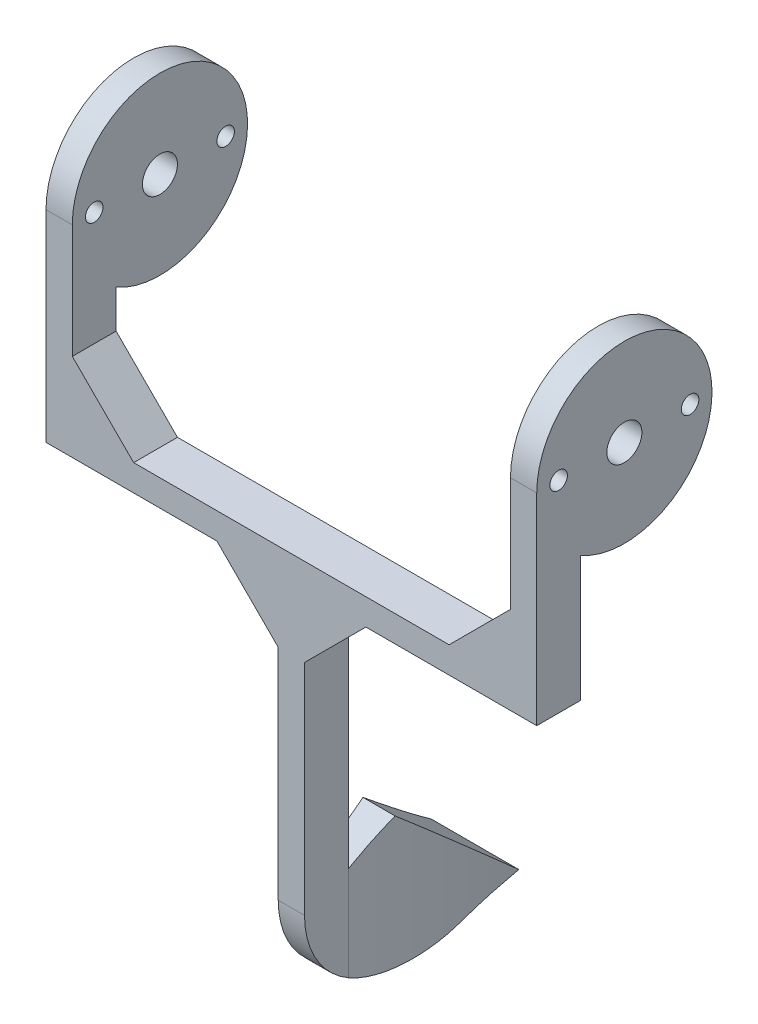
ISO-10303-21;
HEADER;
FILE_DESCRIPTION(('STEP AP214'),'2;1');
FILE_NAME('part.step','',(''),(''),'','','');
FILE_SCHEMA(('AUTOMOTIVE_DESIGN { 1 0 10303 214 1 1 1 1 }'));
ENDSEC;
DATA;
#1=APPLICATION_CONTEXT('core data for automotive mechanical design processes');
#2=APPLICATION_PROTOCOL_DEFINITION('international standard','automotive_design',2000,#1);
#3=PRODUCT_CONTEXT('',#1,'mechanical');
#4=PRODUCT('Part','Part','',(#3));
#5=PRODUCT_RELATED_PRODUCT_CATEGORY('part','',(#4));
#6=PRODUCT_DEFINITION_FORMATION('','',#4);
#7=PRODUCT_DEFINITION_CONTEXT('part definition',#1,'design');
#8=PRODUCT_DEFINITION('design','',#6,#7);
#9=PRODUCT_DEFINITION_SHAPE('','',#8);
#10=(LENGTH_UNIT() NAMED_UNIT(*) SI_UNIT(.MILLI.,.METRE.));
#11=(NAMED_UNIT(*) PLANE_ANGLE_UNIT() SI_UNIT($,.RADIAN.));
#12=(NAMED_UNIT(*) SI_UNIT($,.STERADIAN.) SOLID_ANGLE_UNIT());
#13=UNCERTAINTY_MEASURE_WITH_UNIT(LENGTH_MEASURE(1.E-05),#10,'distance_accuracy_value','');
#14=(GEOMETRIC_REPRESENTATION_CONTEXT(3) GLOBAL_UNCERTAINTY_ASSIGNED_CONTEXT((#13)) GLOBAL_UNIT_ASSIGNED_CONTEXT((#10,
#11,#12)) REPRESENTATION_CONTEXT('',''));
#15=CARTESIAN_POINT('',(0.,0.,0.));
#16=DIRECTION('',(0.,0.,1.));
#17=DIRECTION('',(1.,0.,0.));
#18=AXIS2_PLACEMENT_3D('',#15,#16,#17);
#19=CARTESIAN_POINT('',(1.5,-35.,0.));
#20=DIRECTION('',(1.,0.,0.));
#21=DIRECTION('',(0.,0.,-1.));
#22=AXIS2_PLACEMENT_3D('',#19,#20,#21);
#23=PLANE('',#22);
#24=DIRECTION('',(0.,0.,1.));
#25=VECTOR('',#24,1.);
#26=CARTESIAN_POINT('',(1.5,-10.,-4.89949493661168));
#27=LINE('',#26,#25);
#28=CARTESIAN_POINT('',(1.5,-10.,5.));
#29=VERTEX_POINT('',#28);
#30=CARTESIAN_POINT('',(1.5,-10.,10.));
#31=VERTEX_POINT('',#30);
#32=EDGE_CURVE('E379',#29,#31,#27,.T.);
#33=ORIENTED_EDGE('',*,*,#32,.T.);
#34=DIRECTION('',(0.,-1.,0.));
#35=VECTOR('',#34,1.);
#36=CARTESIAN_POINT('',(1.5,-3.,10.));
#37=LINE('',#36,#35);
#38=CARTESIAN_POINT('',(1.5,-35.,10.));
#39=VERTEX_POINT('',#38);
#40=EDGE_CURVE('E458',#31,#39,#37,.T.);
#41=ORIENTED_EDGE('',*,*,#40,.T.);
#42=CARTESIAN_POINT('',(1.49999999999999,-35.,0.));
#43=DIRECTION('',(-1.,0.,0.));
#44=DIRECTION('',(0.,0.,1.));
#45=AXIS2_PLACEMENT_3D('',#42,#43,#44);
#46=CIRCLE('',#45,10.);
#47=CARTESIAN_POINT('',(1.5,-43.6602540378444,5.));
#48=VERTEX_POINT('',#47);
#49=EDGE_CURVE('E439',#48,#39,#46,.T.);
#50=ORIENTED_EDGE('',*,*,#49,.F.);
#51=DIRECTION('',(0.,1.,0.));
#52=VECTOR('',#51,1.);
#53=CARTESIAN_POINT('',(1.5,-45.,5.));
#54=LINE('',#53,#52);
#55=CARTESIAN_POINT('',(1.5,-32.8867513459482,5.));
#56=VERTEX_POINT('',#55);
#57=EDGE_CURVE('E240',#48,#56,#54,.T.);
#58=ORIENTED_EDGE('',*,*,#57,.T.);
#59=DIRECTION('',(0.,1.,0.));
#60=VECTOR('',#59,1.);
#61=CARTESIAN_POINT('',(1.5,-3.,5.));
#62=LINE('',#61,#60);
#63=EDGE_CURVE('E315',#56,#29,#62,.T.);
#64=ORIENTED_EDGE('',*,*,#63,.T.);
#65=EDGE_LOOP('',(#33,#41,#50,#58,#64));
#66=FACE_BOUND('',#65,.T.);
#67=ADVANCED_FACE('F36',(#66),#23,.T.);
#68=CARTESIAN_POINT('',(-1.5,-35.,0.));
#69=DIRECTION('',(1.,0.,0.));
#70=DIRECTION('',(0.,0.,-1.));
#71=AXIS2_PLACEMENT_3D('',#68,#69,#70);
#72=PLANE('',#71);
#73=DIRECTION('',(0.,-1.,0.));
#74=VECTOR('',#73,1.);
#75=CARTESIAN_POINT('',(-1.5,-3.,10.));
#76=LINE('',#75,#74);
#77=CARTESIAN_POINT('',(-1.5,-10.,10.));
#78=VERTEX_POINT('',#77);
#79=CARTESIAN_POINT('',(-1.50000000000001,-35.,10.));
#80=VERTEX_POINT('',#79);
#81=EDGE_CURVE('E429',#78,#80,#76,.T.);
#82=ORIENTED_EDGE('',*,*,#81,.F.);
#83=DIRECTION('',(0.,0.,1.));
#84=VECTOR('',#83,1.);
#85=CARTESIAN_POINT('',(-1.5,-10.,-4.89949493661168));
#86=LINE('',#85,#84);
#87=CARTESIAN_POINT('',(-1.5,-10.,5.));
#88=VERTEX_POINT('',#87);
#89=EDGE_CURVE('E392',#88,#78,#86,.T.);
#90=ORIENTED_EDGE('',*,*,#89,.F.);
#91=DIRECTION('',(0.,1.,0.));
#92=VECTOR('',#91,1.);
#93=CARTESIAN_POINT('',(-1.5,-3.,5.));
#94=LINE('',#93,#92);
#95=CARTESIAN_POINT('',(-1.50000000000001,-32.8867513459482,5.));
#96=VERTEX_POINT('',#95);
#97=EDGE_CURVE('E431',#96,#88,#94,.T.);
#98=ORIENTED_EDGE('',*,*,#97,.F.);
#99=DIRECTION('',(0.,1.,0.));
#100=VECTOR('',#99,1.);
#101=CARTESIAN_POINT('',(-1.50000000000001,-45.,5.));
#102=LINE('',#101,#100);
#103=CARTESIAN_POINT('',(-1.50000000000001,-43.6602540378444,5.));
#104=VERTEX_POINT('',#103);
#105=EDGE_CURVE('E242',#104,#96,#102,.T.);
#106=ORIENTED_EDGE('',*,*,#105,.F.);
#107=CARTESIAN_POINT('',(-1.5,-35.,0.));
#108=DIRECTION('',(1.,0.,0.));
#109=DIRECTION('',(0.,0.,-1.));
#110=AXIS2_PLACEMENT_3D('',#107,#108,#109);
#111=CIRCLE('',#110,10.);
#112=EDGE_CURVE('E436',#80,#104,#111,.T.);
#113=ORIENTED_EDGE('',*,*,#112,.F.);
#114=EDGE_LOOP('',(#82,#90,#98,#106,#113));
#115=FACE_BOUND('',#114,.T.);
#116=ADVANCED_FACE('F288',(#115),#72,.F.);
#117=CARTESIAN_POINT('',(0.,-3.,10.));
#118=DIRECTION('',(0.,1.,0.));
#119=DIRECTION('',(-1.,0.,0.));
#120=AXIS2_PLACEMENT_3D('',#117,#118,#119);
#121=PLANE('',#120);
#122=DIRECTION('',(1.,0.,0.));
#123=VECTOR('',#122,1.);
#124=CARTESIAN_POINT('',(0.,-3.,10.));
#125=LINE('',#124,#123);
#126=CARTESIAN_POINT('',(8.5,-3.,10.));
#127=VERTEX_POINT('',#126);
#128=CARTESIAN_POINT('',(28.,-3.,10.));
#129=VERTEX_POINT('',#128);
#130=EDGE_CURVE('E61',#127,#129,#125,.T.);
#131=ORIENTED_EDGE('',*,*,#130,.F.);
#132=DIRECTION('',(0.,0.,1.));
#133=VECTOR('',#132,1.);
#134=CARTESIAN_POINT('',(8.5,-3.,-4.89949493661168));
#135=LINE('',#134,#133);
#136=CARTESIAN_POINT('',(8.49999999999999,-3.,5.));
#137=VERTEX_POINT('',#136);
#138=EDGE_CURVE('E383',#137,#127,#135,.T.);
#139=ORIENTED_EDGE('',*,*,#138,.F.);
#140=DIRECTION('',(1.,0.,0.));
#141=VECTOR('',#140,1.);
#142=CARTESIAN_POINT('',(-28.,-3.,5.));
#143=LINE('',#142,#141);
#144=CARTESIAN_POINT('',(28.,-3.,5.));
#145=VERTEX_POINT('',#144);
#146=EDGE_CURVE('E322',#137,#145,#143,.T.);
#147=ORIENTED_EDGE('',*,*,#146,.T.);
#148=DIRECTION('',(0.,0.,-1.));
#149=VECTOR('',#148,1.);
#150=CARTESIAN_POINT('',(28.,-3.,10.));
#151=LINE('',#150,#149);
#152=EDGE_CURVE('E198',#129,#145,#151,.T.);
#153=ORIENTED_EDGE('',*,*,#152,.F.);
#154=EDGE_LOOP('',(#131,#139,#147,#153));
#155=FACE_BOUND('',#154,.T.);
#156=ADVANCED_FACE('F291',(#155),#121,.F.);
#157=CARTESIAN_POINT('',(-25.,0.,10.));
#158=DIRECTION('',(-1.,0.,0.));
#159=DIRECTION('',(0.,0.,1.));
#160=AXIS2_PLACEMENT_3D('',#157,#158,#159);
#161=PLANE('',#160);
#162=CARTESIAN_POINT('',(-25.,20.,7.5));
#163=DIRECTION('',(-1.,0.,0.));
#164=DIRECTION('',(0.,0.,1.));
#165=AXIS2_PLACEMENT_3D('',#162,#163,#164);
#166=CIRCLE('',#165,1.);
#167=CARTESIAN_POINT('',(-25.,20.,8.5));
#168=VERTEX_POINT('',#167);
#169=EDGE_CURVE('E237',#168,#168,#166,.T.);
#170=ORIENTED_EDGE('',*,*,#169,.T.);
#171=EDGE_LOOP('',(#170));
#172=FACE_BOUND('',#171,.T.);
#173=CARTESIAN_POINT('',(-25.,20.,-7.5));
#174=DIRECTION('',(-1.,0.,0.));
#175=DIRECTION('',(0.,0.,1.));
#176=AXIS2_PLACEMENT_3D('',#173,#174,#175);
#177=CIRCLE('',#176,1.);
#178=CARTESIAN_POINT('',(-25.,20.,-6.5));
#179=VERTEX_POINT('',#178);
#180=EDGE_CURVE('E214',#179,#179,#177,.T.);
#181=ORIENTED_EDGE('',*,*,#180,.T.);
#182=EDGE_LOOP('',(#181));
#183=FACE_BOUND('',#182,.T.);
#184=CARTESIAN_POINT('',(-25.,20.,0.));
#185=DIRECTION('',(-1.,0.,0.));
#186=DIRECTION('',(0.,0.,1.));
#187=AXIS2_PLACEMENT_3D('',#184,#185,#186);
#188=CIRCLE('',#187,2.);
#189=CARTESIAN_POINT('',(-25.,20.,2.));
#190=VERTEX_POINT('',#189);
#191=EDGE_CURVE('E210',#190,#190,#188,.T.);
#192=ORIENTED_EDGE('',*,*,#191,.T.);
#193=EDGE_LOOP('',(#192));
#194=FACE_BOUND('',#193,.T.);
#195=DIRECTION('',(0.,1.,0.));
#196=VECTOR('',#195,1.);
#197=CARTESIAN_POINT('',(-25.,0.,10.));
#198=LINE('',#197,#196);
#199=CARTESIAN_POINT('',(-25.,6.99999999999986,10.));
#200=VERTEX_POINT('',#199);
#201=CARTESIAN_POINT('',(-25.,20.,10.));
#202=VERTEX_POINT('',#201);
#203=EDGE_CURVE('E352',#200,#202,#198,.T.);
#204=ORIENTED_EDGE('',*,*,#203,.F.);
#205=DIRECTION('',(0.,0.,1.));
#206=VECTOR('',#205,1.);
#207=CARTESIAN_POINT('',(-25.,6.99999999999986,-4.89949493661168));
#208=LINE('',#207,#206);
#209=CARTESIAN_POINT('',(-25.,6.99999999999986,5.));
#210=VERTEX_POINT('',#209);
#211=EDGE_CURVE('E400',#210,#200,#208,.T.);
#212=ORIENTED_EDGE('',*,*,#211,.F.);
#213=DIRECTION('',(0.,-1.,0.));
#214=VECTOR('',#213,1.);
#215=CARTESIAN_POINT('',(-25.,0.,5.));
#216=LINE('',#215,#214);
#217=CARTESIAN_POINT('',(-25.,11.3397459621556,5.));
#218=VERTEX_POINT('',#217);
#219=EDGE_CURVE('E332',#218,#210,#216,.T.);
#220=ORIENTED_EDGE('',*,*,#219,.F.);
#221=CARTESIAN_POINT('',(-25.,20.,0.));
#222=DIRECTION('',(-1.,0.,0.));
#223=DIRECTION('',(0.,0.,1.));
#224=AXIS2_PLACEMENT_3D('',#221,#222,#223);
#225=CIRCLE('',#224,10.);
#226=EDGE_CURVE('E211',#202,#218,#225,.T.);
#227=ORIENTED_EDGE('',*,*,#226,.F.);
#228=EDGE_LOOP('',(#204,#212,#220,#227));
#229=FACE_BOUND('',#228,.T.);
#230=ADVANCED_FACE('F38',(#172,#183,#194,#229),#161,.F.);
#231=CARTESIAN_POINT('',(-28.,-3.,10.));
#232=DIRECTION('',(1.,0.,0.));
#233=DIRECTION('',(0.,0.,-1.));
#234=AXIS2_PLACEMENT_3D('',#231,#232,#233);
#235=PLANE('',#234);
#236=CARTESIAN_POINT('',(-28.,20.,7.5));
#237=DIRECTION('',(1.,0.,0.));
#238=DIRECTION('',(0.,0.,-1.));
#239=AXIS2_PLACEMENT_3D('',#236,#237,#238);
#240=CIRCLE('',#239,1.);
#241=CARTESIAN_POINT('',(-28.,20.,6.5));
#242=VERTEX_POINT('',#241);
#243=EDGE_CURVE('E215',#242,#242,#240,.T.);
#244=ORIENTED_EDGE('',*,*,#243,.T.);
#245=EDGE_LOOP('',(#244));
#246=FACE_BOUND('',#245,.T.);
#247=CARTESIAN_POINT('',(-28.,20.,-7.5));
#248=DIRECTION('',(1.,0.,0.));
#249=DIRECTION('',(0.,0.,-1.));
#250=AXIS2_PLACEMENT_3D('',#247,#248,#249);
#251=CIRCLE('',#250,1.);
#252=CARTESIAN_POINT('',(-28.,20.,-8.5));
#253=VERTEX_POINT('',#252);
#254=EDGE_CURVE('E226',#253,#253,#251,.T.);
#255=ORIENTED_EDGE('',*,*,#254,.T.);
#256=EDGE_LOOP('',(#255));
#257=FACE_BOUND('',#256,.T.);
#258=CARTESIAN_POINT('',(-28.,20.,0.));
#259=DIRECTION('',(-1.,0.,0.));
#260=DIRECTION('',(0.,0.,1.));
#261=AXIS2_PLACEMENT_3D('',#258,#259,#260);
#262=CIRCLE('',#261,2.);
#263=CARTESIAN_POINT('',(-28.,20.,2.));
#264=VERTEX_POINT('',#263);
#265=EDGE_CURVE('E341',#264,#264,#262,.T.);
#266=ORIENTED_EDGE('',*,*,#265,.F.);
#267=EDGE_LOOP('',(#266));
#268=FACE_BOUND('',#267,.T.);
#269=CARTESIAN_POINT('',(-28.,20.,0.));
#270=DIRECTION('',(-1.,0.,0.));
#271=DIRECTION('',(0.,0.,-1.));
#272=AXIS2_PLACEMENT_3D('',#269,#270,#271);
#273=CIRCLE('',#272,10.);
#274=CARTESIAN_POINT('',(-28.,20.,10.));
#275=VERTEX_POINT('',#274);
#276=CARTESIAN_POINT('',(-28.,11.3397459621556,5.));
#277=VERTEX_POINT('',#276);
#278=EDGE_CURVE('E335',#275,#277,#273,.T.);
#279=ORIENTED_EDGE('',*,*,#278,.T.);
#280=DIRECTION('',(0.,1.,0.));
#281=VECTOR('',#280,1.);
#282=CARTESIAN_POINT('',(-28.,11.3397459621556,5.));
#283=LINE('',#282,#281);
#284=CARTESIAN_POINT('',(-28.,-3.,5.));
#285=VERTEX_POINT('',#284);
#286=EDGE_CURVE('E319',#285,#277,#283,.T.);
#287=ORIENTED_EDGE('',*,*,#286,.F.);
#288=DIRECTION('',(0.,0.,-1.));
#289=VECTOR('',#288,1.);
#290=CARTESIAN_POINT('',(-28.,-3.,10.));
#291=LINE('',#290,#289);
#292=CARTESIAN_POINT('',(-28.,-3.,10.));
#293=VERTEX_POINT('',#292);
#294=EDGE_CURVE('E45',#293,#285,#291,.T.);
#295=ORIENTED_EDGE('',*,*,#294,.F.);
#296=DIRECTION('',(0.,-1.,0.));
#297=VECTOR('',#296,1.);
#298=CARTESIAN_POINT('',(-28.,-3.,10.));
#299=LINE('',#298,#297);
#300=EDGE_CURVE('E354',#275,#293,#299,.T.);
#301=ORIENTED_EDGE('',*,*,#300,.F.);
#302=EDGE_LOOP('',(#279,#287,#295,#301));
#303=FACE_BOUND('',#302,.T.);
#304=ADVANCED_FACE('F420',(#246,#257,#268,#303),#235,.F.);
#305=CARTESIAN_POINT('',(28.,-3.,10.));
#306=DIRECTION('',(-1.,0.,0.));
#307=DIRECTION('',(0.,0.,1.));
#308=AXIS2_PLACEMENT_3D('',#305,#306,#307);
#309=PLANE('',#308);
#310=CARTESIAN_POINT('',(28.,20.,7.5));
#311=DIRECTION('',(1.,0.,0.));
#312=DIRECTION('',(0.,0.,-1.));
#313=AXIS2_PLACEMENT_3D('',#310,#311,#312);
#314=CIRCLE('',#313,1.);
#315=CARTESIAN_POINT('',(28.,20.,6.5));
#316=VERTEX_POINT('',#315);
#317=EDGE_CURVE('E221',#316,#316,#314,.T.);
#318=ORIENTED_EDGE('',*,*,#317,.F.);
#319=EDGE_LOOP('',(#318));
#320=FACE_BOUND('',#319,.T.);
#321=CARTESIAN_POINT('',(28.,20.,-7.5));
#322=DIRECTION('',(1.,0.,0.));
#323=DIRECTION('',(0.,0.,-1.));
#324=AXIS2_PLACEMENT_3D('',#321,#322,#323);
#325=CIRCLE('',#324,1.);
#326=CARTESIAN_POINT('',(28.,20.,-8.5));
#327=VERTEX_POINT('',#326);
#328=EDGE_CURVE('E234',#327,#327,#325,.T.);
#329=ORIENTED_EDGE('',*,*,#328,.F.);
#330=EDGE_LOOP('',(#329));
#331=FACE_BOUND('',#330,.T.);
#332=CARTESIAN_POINT('',(28.,20.,0.));
#333=DIRECTION('',(-1.,0.,0.));
#334=DIRECTION('',(0.,0.,1.));
#335=AXIS2_PLACEMENT_3D('',#332,#333,#334);
#336=CIRCLE('',#335,2.);
#337=CARTESIAN_POINT('',(28.,20.,2.));
#338=VERTEX_POINT('',#337);
#339=EDGE_CURVE('E342',#338,#338,#336,.T.);
#340=ORIENTED_EDGE('',*,*,#339,.T.);
#341=EDGE_LOOP('',(#340));
#342=FACE_BOUND('',#341,.T.);
#343=DIRECTION('',(0.,1.,0.));
#344=VECTOR('',#343,1.);
#345=CARTESIAN_POINT('',(28.,11.3397459621556,5.));
#346=LINE('',#345,#344);
#347=CARTESIAN_POINT('',(28.,11.3397459621556,5.));
#348=VERTEX_POINT('',#347);
#349=EDGE_CURVE('E313',#145,#348,#346,.T.);
#350=ORIENTED_EDGE('',*,*,#349,.T.);
#351=CARTESIAN_POINT('',(28.,20.,0.));
#352=DIRECTION('',(-1.,0.,0.));
#353=DIRECTION('',(0.,0.,-1.));
#354=AXIS2_PLACEMENT_3D('',#351,#352,#353);
#355=CIRCLE('',#354,10.);
#356=CARTESIAN_POINT('',(28.,20.,10.));
#357=VERTEX_POINT('',#356);
#358=EDGE_CURVE('E336',#357,#348,#355,.T.);
#359=ORIENTED_EDGE('',*,*,#358,.F.);
#360=DIRECTION('',(0.,1.,0.));
#361=VECTOR('',#360,1.);
#362=CARTESIAN_POINT('',(28.,-3.,10.));
#363=LINE('',#362,#361);
#364=EDGE_CURVE('E196',#129,#357,#363,.T.);
#365=ORIENTED_EDGE('',*,*,#364,.F.);
#366=ORIENTED_EDGE('',*,*,#152,.T.);
#367=EDGE_LOOP('',(#350,#359,#365,#366));
#368=FACE_BOUND('',#367,.T.);
#369=ADVANCED_FACE('F367',(#320,#331,#342,#368),#309,.F.);
#370=CARTESIAN_POINT('',(25.,0.,10.));
#371=DIRECTION('',(1.,0.,0.));
#372=DIRECTION('',(0.,0.,-1.));
#373=AXIS2_PLACEMENT_3D('',#370,#371,#372);
#374=PLANE('',#373);
#375=CARTESIAN_POINT('',(25.,20.,7.5));
#376=DIRECTION('',(1.,0.,0.));
#377=DIRECTION('',(0.,0.,-1.));
#378=AXIS2_PLACEMENT_3D('',#375,#376,#377);
#379=CIRCLE('',#378,1.);
#380=CARTESIAN_POINT('',(25.,20.,6.5));
#381=VERTEX_POINT('',#380);
#382=EDGE_CURVE('E40',#381,#381,#379,.T.);
#383=ORIENTED_EDGE('',*,*,#382,.T.);
#384=EDGE_LOOP('',(#383));
#385=FACE_BOUND('',#384,.T.);
#386=CARTESIAN_POINT('',(25.,20.,-7.5));
#387=DIRECTION('',(1.,0.,0.));
#388=DIRECTION('',(0.,0.,-1.));
#389=AXIS2_PLACEMENT_3D('',#386,#387,#388);
#390=CIRCLE('',#389,1.);
#391=CARTESIAN_POINT('',(25.,20.,-8.5));
#392=VERTEX_POINT('',#391);
#393=EDGE_CURVE('E212',#392,#392,#390,.T.);
#394=ORIENTED_EDGE('',*,*,#393,.T.);
#395=EDGE_LOOP('',(#394));
#396=FACE_BOUND('',#395,.T.);
#397=CARTESIAN_POINT('',(25.,20.,0.));
#398=DIRECTION('',(1.,0.,0.));
#399=DIRECTION('',(0.,0.,-1.));
#400=AXIS2_PLACEMENT_3D('',#397,#398,#399);
#401=CIRCLE('',#400,2.);
#402=CARTESIAN_POINT('',(25.,20.,-2.));
#403=VERTEX_POINT('',#402);
#404=EDGE_CURVE('E208',#403,#403,#401,.T.);
#405=ORIENTED_EDGE('',*,*,#404,.T.);
#406=EDGE_LOOP('',(#405));
#407=FACE_BOUND('',#406,.T.);
#408=DIRECTION('',(0.,1.,0.));
#409=VECTOR('',#408,1.);
#410=CARTESIAN_POINT('',(25.,0.,5.));
#411=LINE('',#410,#409);
#412=CARTESIAN_POINT('',(25.,6.99999999999987,5.));
#413=VERTEX_POINT('',#412);
#414=CARTESIAN_POINT('',(25.,11.3397459621556,5.));
#415=VERTEX_POINT('',#414);
#416=EDGE_CURVE('E187',#413,#415,#411,.T.);
#417=ORIENTED_EDGE('',*,*,#416,.F.);
#418=DIRECTION('',(0.,0.,1.));
#419=VECTOR('',#418,1.);
#420=CARTESIAN_POINT('',(25.,6.99999999999987,-4.89949493661168));
#421=LINE('',#420,#419);
#422=CARTESIAN_POINT('',(25.,6.99999999999987,10.));
#423=VERTEX_POINT('',#422);
#424=EDGE_CURVE('E53',#413,#423,#421,.T.);
#425=ORIENTED_EDGE('',*,*,#424,.T.);
#426=DIRECTION('',(0.,-1.,0.));
#427=VECTOR('',#426,1.);
#428=CARTESIAN_POINT('',(25.,0.,10.));
#429=LINE('',#428,#427);
#430=CARTESIAN_POINT('',(25.,20.,10.));
#431=VERTEX_POINT('',#430);
#432=EDGE_CURVE('E186',#431,#423,#429,.T.);
#433=ORIENTED_EDGE('',*,*,#432,.F.);
#434=CARTESIAN_POINT('',(25.,20.,0.));
#435=DIRECTION('',(1.,0.,0.));
#436=DIRECTION('',(0.,0.,-1.));
#437=AXIS2_PLACEMENT_3D('',#434,#435,#436);
#438=CIRCLE('',#437,10.);
#439=EDGE_CURVE('E345',#415,#431,#438,.T.);
#440=ORIENTED_EDGE('',*,*,#439,.F.);
#441=EDGE_LOOP('',(#417,#425,#433,#440));
#442=FACE_BOUND('',#441,.T.);
#443=ADVANCED_FACE('F184',(#385,#396,#407,#442),#374,.F.);
#444=CARTESIAN_POINT('',(-8.49999999999999,-3.00000000000001,5.));
#445=VERTEX_POINT('',#444);
#446=EDGE_CURVE('E329',#285,#445,#143,.T.);
#447=ORIENTED_EDGE('',*,*,#446,.T.);
#448=DIRECTION('',(0.,0.,1.));
#449=VECTOR('',#448,1.);
#450=CARTESIAN_POINT('',(-8.5,-3.,-4.89949493661168));
#451=LINE('',#450,#449);
#452=CARTESIAN_POINT('',(-8.5,-3.,10.));
#453=VERTEX_POINT('',#452);
#454=EDGE_CURVE('E388',#445,#453,#451,.T.);
#455=ORIENTED_EDGE('',*,*,#454,.T.);
#456=EDGE_CURVE('E200',#293,#453,#125,.T.);
#457=ORIENTED_EDGE('',*,*,#456,.F.);
#458=ORIENTED_EDGE('',*,*,#294,.T.);
#459=EDGE_LOOP('',(#447,#455,#457,#458));
#460=FACE_BOUND('',#459,.T.);
#461=ADVANCED_FACE('F423',(#460),#121,.F.);
#462=CARTESIAN_POINT('',(0.,0.,10.));
#463=DIRECTION('',(0.,-1.,0.));
#464=DIRECTION('',(1.,0.,0.));
#465=AXIS2_PLACEMENT_3D('',#462,#463,#464);
#466=PLANE('',#465);
#467=DIRECTION('',(-1.,0.,0.));
#468=VECTOR('',#467,1.);
#469=CARTESIAN_POINT('',(0.,0.,10.));
#470=LINE('',#469,#468);
#471=CARTESIAN_POINT('',(18.,0.,10.));
#472=VERTEX_POINT('',#471);
#473=CARTESIAN_POINT('',(-18.,0.,10.));
#474=VERTEX_POINT('',#473);
#475=EDGE_CURVE('E195',#472,#474,#470,.T.);
#476=ORIENTED_EDGE('',*,*,#475,.F.);
#477=DIRECTION('',(0.,0.,1.));
#478=VECTOR('',#477,1.);
#479=CARTESIAN_POINT('',(18.,0.,-4.89949493661168));
#480=LINE('',#479,#478);
#481=CARTESIAN_POINT('',(18.,0.,5.));
#482=VERTEX_POINT('',#481);
#483=EDGE_CURVE('E176',#482,#472,#480,.T.);
#484=ORIENTED_EDGE('',*,*,#483,.F.);
#485=DIRECTION('',(1.,0.,0.));
#486=VECTOR('',#485,1.);
#487=CARTESIAN_POINT('',(0.,0.,5.));
#488=LINE('',#487,#486);
#489=CARTESIAN_POINT('',(-18.,0.,5.));
#490=VERTEX_POINT('',#489);
#491=EDGE_CURVE('E12',#490,#482,#488,.T.);
#492=ORIENTED_EDGE('',*,*,#491,.F.);
#493=DIRECTION('',(0.,0.,1.));
#494=VECTOR('',#493,1.);
#495=CARTESIAN_POINT('',(-18.,0.,-4.89949493661168));
#496=LINE('',#495,#494);
#497=EDGE_CURVE('E229',#490,#474,#496,.T.);
#498=ORIENTED_EDGE('',*,*,#497,.T.);
#499=EDGE_LOOP('',(#476,#484,#492,#498));
#500=FACE_BOUND('',#499,.T.);
#501=ADVANCED_FACE('F406',(#500),#466,.F.);
#502=CARTESIAN_POINT('',(0.,0.,10.));
#503=DIRECTION('',(0.,0.,1.));
#504=DIRECTION('',(1.,0.,0.));
#505=AXIS2_PLACEMENT_3D('',#502,#503,#504);
#506=PLANE('',#505);
#507=DIRECTION('',(-0.707106781186554,-0.707106781186541,0.));
#508=VECTOR('',#507,1.);
#509=CARTESIAN_POINT('',(25.,6.99999999999987,10.));
#510=LINE('',#509,#508);
#511=EDGE_CURVE('E173',#423,#472,#510,.T.);
#512=ORIENTED_EDGE('',*,*,#511,.T.);
#513=ORIENTED_EDGE('',*,*,#475,.T.);
#514=DIRECTION('',(-0.707106781186554,0.707106781186541,0.));
#515=VECTOR('',#514,1.);
#516=CARTESIAN_POINT('',(-25.,6.99999999999986,10.));
#517=LINE('',#516,#515);
#518=EDGE_CURVE('E396',#474,#200,#517,.T.);
#519=ORIENTED_EDGE('',*,*,#518,.T.);
#520=ORIENTED_EDGE('',*,*,#203,.T.);
#521=DIRECTION('',(-1.,0.,0.));
#522=VECTOR('',#521,1.);
#523=CARTESIAN_POINT('',(28.,20.,10.));
#524=LINE('',#523,#522);
#525=EDGE_CURVE('E338',#202,#275,#524,.T.);
#526=ORIENTED_EDGE('',*,*,#525,.T.);
#527=ORIENTED_EDGE('',*,*,#300,.T.);
#528=ORIENTED_EDGE('',*,*,#456,.T.);
#529=DIRECTION('',(0.707106781186546,-0.707106781186549,0.));
#530=VECTOR('',#529,1.);
#531=CARTESIAN_POINT('',(-8.5,-3.,10.));
#532=LINE('',#531,#530);
#533=EDGE_CURVE('E386',#453,#78,#532,.T.);
#534=ORIENTED_EDGE('',*,*,#533,.T.);
#535=ORIENTED_EDGE('',*,*,#81,.T.);
#536=DIRECTION('',(-1.,0.,0.));
#537=VECTOR('',#536,1.);
#538=CARTESIAN_POINT('',(1.5,-35.,10.));
#539=LINE('',#538,#537);
#540=EDGE_CURVE('E309',#39,#80,#539,.T.);
#541=ORIENTED_EDGE('',*,*,#540,.F.);
#542=ORIENTED_EDGE('',*,*,#40,.F.);
#543=DIRECTION('',(0.707106781186546,0.707106781186549,0.));
#544=VECTOR('',#543,1.);
#545=CARTESIAN_POINT('',(8.5,-3.,10.));
#546=LINE('',#545,#544);
#547=EDGE_CURVE('E363',#31,#127,#546,.T.);
#548=ORIENTED_EDGE('',*,*,#547,.T.);
#549=ORIENTED_EDGE('',*,*,#130,.T.);
#550=ORIENTED_EDGE('',*,*,#364,.T.);
#551=EDGE_CURVE('E194',#357,#431,#524,.T.);
#552=ORIENTED_EDGE('',*,*,#551,.T.);
#553=ORIENTED_EDGE('',*,*,#432,.T.);
#554=EDGE_LOOP('',(#512,#513,#519,#520,#526,#527,#528,#534,#535,#541,#542,#548,#549,#550,#552,#553));
#555=FACE_BOUND('',#554,.T.);
#556=ADVANCED_FACE('F191',(#555),#506,.T.);
#557=CARTESIAN_POINT('',(28.,20.,0.));
#558=DIRECTION('',(-1.,0.,0.));
#559=DIRECTION('',(0.,0.,1.));
#560=AXIS2_PLACEMENT_3D('',#557,#558,#559);
#561=CYLINDRICAL_SURFACE('',#560,10.);
#562=ORIENTED_EDGE('',*,*,#226,.T.);
#563=DIRECTION('',(1.,0.,0.));
#564=VECTOR('',#563,1.);
#565=CARTESIAN_POINT('',(-28.,11.3397459621556,5.));
#566=LINE('',#565,#564);
#567=EDGE_CURVE('E325',#277,#218,#566,.T.);
#568=ORIENTED_EDGE('',*,*,#567,.F.);
#569=ORIENTED_EDGE('',*,*,#278,.F.);
#570=ORIENTED_EDGE('',*,*,#525,.F.);
#571=EDGE_LOOP('',(#562,#568,#569,#570));
#572=FACE_BOUND('',#571,.T.);
#573=ADVANCED_FACE('F417',(#572),#561,.T.);
#574=ORIENTED_EDGE('',*,*,#551,.F.);
#575=ORIENTED_EDGE('',*,*,#358,.T.);
#576=EDGE_CURVE('E328',#415,#348,#566,.T.);
#577=ORIENTED_EDGE('',*,*,#576,.F.);
#578=ORIENTED_EDGE('',*,*,#439,.T.);
#579=EDGE_LOOP('',(#574,#575,#577,#578));
#580=FACE_BOUND('',#579,.T.);
#581=ADVANCED_FACE('F371',(#580),#561,.T.);
#582=CARTESIAN_POINT('',(28.,20.,0.));
#583=DIRECTION('',(-1.,0.,0.));
#584=DIRECTION('',(0.,0.,1.));
#585=AXIS2_PLACEMENT_3D('',#582,#583,#584);
#586=CYLINDRICAL_SURFACE('',#585,2.);
#587=ORIENTED_EDGE('',*,*,#339,.F.);
#588=EDGE_LOOP('',(#587));
#589=FACE_BOUND('',#588,.T.);
#590=ORIENTED_EDGE('',*,*,#404,.F.);
#591=EDGE_LOOP('',(#590));
#592=FACE_BOUND('',#591,.T.);
#593=ADVANCED_FACE('F704',(#589,#592),#586,.F.);
#594=ORIENTED_EDGE('',*,*,#265,.T.);
#595=EDGE_LOOP('',(#594));
#596=FACE_BOUND('',#595,.T.);
#597=ORIENTED_EDGE('',*,*,#191,.F.);
#598=EDGE_LOOP('',(#597));
#599=FACE_BOUND('',#598,.T.);
#600=ADVANCED_FACE('F551',(#596,#599),#586,.F.);
#601=CARTESIAN_POINT('',(-28.,11.3397459621556,5.));
#602=DIRECTION('',(0.,0.,-1.));
#603=DIRECTION('',(0.,1.,0.));
#604=AXIS2_PLACEMENT_3D('',#601,#602,#603);
#605=PLANE('',#604);
#606=ORIENTED_EDGE('',*,*,#146,.F.);
#607=DIRECTION('',(0.707106781186546,0.707106781186549,0.));
#608=VECTOR('',#607,1.);
#609=CARTESIAN_POINT('',(8.5,-3.,5.));
#610=LINE('',#609,#608);
#611=EDGE_CURVE('E380',#29,#137,#610,.T.);
#612=ORIENTED_EDGE('',*,*,#611,.F.);
#613=ORIENTED_EDGE('',*,*,#63,.F.);
#614=DIRECTION('',(-1.,0.,0.));
#615=VECTOR('',#614,1.);
#616=CARTESIAN_POINT('',(1.5,-32.8867513459482,5.));
#617=LINE('',#616,#615);
#618=EDGE_CURVE('E310',#56,#96,#617,.T.);
#619=ORIENTED_EDGE('',*,*,#618,.T.);
#620=ORIENTED_EDGE('',*,*,#97,.T.);
#621=DIRECTION('',(0.707106781186546,-0.707106781186549,0.));
#622=VECTOR('',#621,1.);
#623=CARTESIAN_POINT('',(-8.5,-3.,5.));
#624=LINE('',#623,#622);
#625=EDGE_CURVE('E389',#445,#88,#624,.T.);
#626=ORIENTED_EDGE('',*,*,#625,.F.);
#627=ORIENTED_EDGE('',*,*,#446,.F.);
#628=ORIENTED_EDGE('',*,*,#286,.T.);
#629=ORIENTED_EDGE('',*,*,#567,.T.);
#630=ORIENTED_EDGE('',*,*,#219,.T.);
#631=DIRECTION('',(-0.707106781186554,0.707106781186541,0.));
#632=VECTOR('',#631,1.);
#633=CARTESIAN_POINT('',(-25.,6.99999999999986,5.));
#634=LINE('',#633,#632);
#635=EDGE_CURVE('E399',#490,#210,#634,.T.);
#636=ORIENTED_EDGE('',*,*,#635,.F.);
#637=ORIENTED_EDGE('',*,*,#491,.T.);
#638=DIRECTION('',(-0.707106781186554,-0.707106781186541,0.));
#639=VECTOR('',#638,1.);
#640=CARTESIAN_POINT('',(25.,6.99999999999987,5.));
#641=LINE('',#640,#639);
#642=EDGE_CURVE('E188',#413,#482,#641,.T.);
#643=ORIENTED_EDGE('',*,*,#642,.F.);
#644=ORIENTED_EDGE('',*,*,#416,.T.);
#645=ORIENTED_EDGE('',*,*,#576,.T.);
#646=ORIENTED_EDGE('',*,*,#349,.F.);
#647=EDGE_LOOP('',(#606,#612,#613,#619,#620,#626,#627,#628,#629,#630,#636,#637,#643,#644,#645,#646));
#648=FACE_BOUND('',#647,.T.);
#649=ADVANCED_FACE('F298',(#648),#605,.T.);
#650=CARTESIAN_POINT('',(1.5,-35.,0.));
#651=DIRECTION('',(-1.,0.,0.));
#652=DIRECTION('',(0.,0.,1.));
#653=AXIS2_PLACEMENT_3D('',#650,#651,#652);
#654=CYLINDRICAL_SURFACE('',#653,10.);
#655=ORIENTED_EDGE('',*,*,#540,.T.);
#656=ORIENTED_EDGE('',*,*,#112,.T.);
#657=CARTESIAN_POINT('',(-1.50000000000001,-43.6602540378444,5.));
#658=CARTESIAN_POINT('',(-1.49997990130233,-43.7974288862876,4.76247344598478));
#659=CARTESIAN_POINT('',(-1.5022205527359,-43.9247755610899,4.51926731266596));
#660=CARTESIAN_POINT('',(-1.51172079947465,-44.1590416010121,4.02330588579642));
#661=CARTESIAN_POINT('',(-1.51898034778424,-44.2659611573941,3.77055068168156));
#662=CARTESIAN_POINT('',(-1.53900231713092,-44.4584748325847,3.25764231991739));
#663=CARTESIAN_POINT('',(-1.55175731160213,-44.5440974866648,2.99749958741162));
#664=CARTESIAN_POINT('',(-1.58310247579089,-44.6936537710253,2.47140583764725));
#665=CARTESIAN_POINT('',(-1.60169244931445,-44.7575881303977,2.2054550159582));
#666=CARTESIAN_POINT('',(-1.64491774201787,-44.8634357375419,1.66951884291118));
#667=CARTESIAN_POINT('',(-1.66955680402148,-44.9053353008393,1.39953109123491));
#668=CARTESIAN_POINT('',(-1.72491537413444,-44.9668855754517,0.857643568398555));
#669=CARTESIAN_POINT('',(-1.75563508295092,-44.9865355522189,0.585743734411142));
#670=CARTESIAN_POINT('',(-1.82303459545825,-45.0036098830121,0.0420185444296085));
#671=CARTESIAN_POINT('',(-1.85971377081636,-45.0010365786462,-0.229806816393332));
#672=CARTESIAN_POINT('',(-1.93876440673047,-44.9738816641974,-0.771512908611542));
#673=CARTESIAN_POINT('',(-1.98113578058864,-44.9493003892854,-1.04139366955904));
#674=CARTESIAN_POINT('',(-2.07141589921939,-44.8783035270203,-1.57893557177869));
#675=CARTESIAN_POINT('',(-2.11935486807239,-44.8317641219007,-1.84657525325805));
#676=CARTESIAN_POINT('',(-2.22002117377308,-44.7173302758755,-2.37632756674822));
#677=CARTESIAN_POINT('',(-2.27274859505425,-44.6494354583635,-2.63844010119989));
#678=CARTESIAN_POINT('',(-2.38232602339243,-44.4929226155024,-3.15553326677697));
#679=CARTESIAN_POINT('',(-2.43917628154747,-44.4043033272137,-3.41051346220035));
#680=CARTESIAN_POINT('',(-2.55620480627262,-44.2071025969797,-3.91175186467906));
#681=CARTESIAN_POINT('',(-2.61638231720621,-44.0985256746034,-4.15801203142773));
#682=CARTESIAN_POINT('',(-2.75458066870807,-43.8326376019783,-4.70076060794837));
#683=CARTESIAN_POINT('',(-2.83330548983794,-43.6699270378642,-4.99444008933065));
#684=CARTESIAN_POINT('',(-2.99259457439397,-43.3165951363779,-5.56293004062625));
#685=CARTESIAN_POINT('',(-3.07315392767706,-43.1260422655849,-5.83778443516599));
#686=CARTESIAN_POINT('',(-3.1537900812701,-42.9222263157416,-6.10232170588967));
#687=B_SPLINE_CURVE_WITH_KNOTS('',3,(#657,#658,#659,#660,#661,#662,#663,#664,#665,#666,#667,
#668,#669,#670,#671,#672,#673,#674,#675,#676,#677,#678,#679,#680,#681,#682,#683,#684,#685,#686),
.UNSPECIFIED.,.F.,.F.,(4,2,2,2,2,2,2,2,2,2,2,2,2,2,4),(0.,0.822638506343141,1.6452693098256,
2.46679187699964,3.28828682444578,4.11029135185654,4.93232301613214,5.7542680661734,
6.57620059859575,7.40282427955693,8.2294625389807,9.05615118648599,9.88265285373434,
10.9154930963789,11.9458349593837),.UNSPECIFIED.);
#688=CARTESIAN_POINT('',(-3.1537900812701,-42.9222263157416,-6.10232170588967));
#689=VERTEX_POINT('',#688);
#690=EDGE_CURVE('E253',#104,#689,#687,.T.);
#691=ORIENTED_EDGE('',*,*,#690,.T.);
#692=DIRECTION('',(-1.,0.,0.));
#693=VECTOR('',#692,1.);
#694=CARTESIAN_POINT('',(5.,-42.9222263157416,-6.10232170588967));
#695=LINE('',#694,#693);
#696=CARTESIAN_POINT('',(3.1537900812701,-42.9222263157416,-6.10232170588967));
#697=VERTEX_POINT('',#696);
#698=EDGE_CURVE('E432',#697,#689,#695,.T.);
#699=ORIENTED_EDGE('',*,*,#698,.F.);
#700=CARTESIAN_POINT('',(3.1537900812701,-42.9222263157416,-6.10232170588967));
#701=CARTESIAN_POINT('',(3.085511442337,-43.094821744727,-5.87827749374433));
#702=CARTESIAN_POINT('',(3.0172835828635,-43.2579004422302,-5.64687867794984));
#703=CARTESIAN_POINT('',(2.88206223819504,-43.5640384054639,-5.17080930920915));
#704=CARTESIAN_POINT('',(2.81506892449421,-43.7070949077904,-4.92613693073892));
#705=CARTESIAN_POINT('',(2.68337941898816,-43.9723346785262,-4.42467959493372));
#706=CARTESIAN_POINT('',(2.61868647662819,-44.0944892823169,-4.16787861034938));
#707=CARTESIAN_POINT('',(2.49273982525146,-44.316731180419,-3.64409688079374));
#708=CARTESIAN_POINT('',(2.43148592264058,-44.4168197178274,-3.37711671026366));
#709=CARTESIAN_POINT('',(2.31327286623681,-44.594183972068,-2.83430332590369));
#710=CARTESIAN_POINT('',(2.25632006187468,-44.6714264346987,-2.5584578486651));
#711=CARTESIAN_POINT('',(2.14763435363975,-44.8021161207409,-2.00017575603576));
#712=CARTESIAN_POINT('',(2.09590135901496,-44.8555637579061,-1.71773925534215));
#713=CARTESIAN_POINT('',(1.99837438077719,-44.9379838966541,-1.14852509023322));
#714=CARTESIAN_POINT('',(1.95257588891913,-44.9669750703601,-0.861750908168656));
#715=CARTESIAN_POINT('',(1.86739123486715,-45.0000741485846,-0.285831546169312));
#716=CARTESIAN_POINT('',(1.82800467152849,-45.0041836103417,0.00331348425012119));
#717=CARTESIAN_POINT('',(1.75716336518619,-44.98753746092,0.572168312162154));
#718=CARTESIAN_POINT('',(1.72548993951389,-44.9675971129892,0.851874910447294));
#719=CARTESIAN_POINT('',(1.66857794427573,-44.9041737362984,1.40925828203428));
#720=CARTESIAN_POINT('',(1.64333904841417,-44.8606919016791,1.6869351575697));
#721=CARTESIAN_POINT('',(1.59925973709392,-44.750403300723,2.23797821650853));
#722=CARTESIAN_POINT('',(1.58041593430023,-44.6836089206614,2.51134660861527));
#723=CARTESIAN_POINT('',(1.54889315661064,-44.5271290232194,3.05170540077044));
#724=CARTESIAN_POINT('',(1.53621179134128,-44.4374524023449,3.31869823558608));
#725=CARTESIAN_POINT('',(1.51729245003136,-44.2426697546533,3.82646839622487));
#726=CARTESIAN_POINT('',(1.5106751784568,-44.1390263261634,4.06779426393968));
#727=CARTESIAN_POINT('',(1.50202568558868,-43.9133009948167,4.54112425164031));
#728=CARTESIAN_POINT('',(1.49998383463493,-43.791258395054,4.77314693816281));
#729=CARTESIAN_POINT('',(1.5,-43.6602540378444,5.));
#730=B_SPLINE_CURVE_WITH_KNOTS('',3,(#700,#701,#702,#703,#704,#705,#706,#707,#708,#709,#710,
#711,#712,#713,#714,#715,#716,#717,#718,#719,#720,#721,#722,#723,#724,#725,#726,#727,#728,#729),
.UNSPECIFIED.,.F.,.F.,(4,2,2,2,2,2,2,2,2,2,2,2,2,2,4),(0.,0.872588108551899,1.74529653061002,
2.61919234602391,3.49303891772751,4.36815124975858,5.24324836440283,6.11767674998888,
6.99205040831742,7.83759849615845,8.68310369763141,9.52816035273672,10.3728889531366,
11.1602147252723,11.9458818894398),.UNSPECIFIED.);
#731=EDGE_CURVE('E444',#697,#48,#730,.T.);
#732=ORIENTED_EDGE('',*,*,#731,.T.);
#733=ORIENTED_EDGE('',*,*,#49,.T.);
#734=EDGE_LOOP('',(#655,#656,#691,#699,#732,#733));
#735=FACE_BOUND('',#734,.T.);
#736=ADVANCED_FACE('F263',(#735),#654,.T.);
#737=CARTESIAN_POINT('',(1.5,-30.,0.));
#738=DIRECTION('',(0.,-0.866025403784436,-0.500000000000004));
#739=DIRECTION('',(0.,0.500000000000004,-0.866025403784437));
#740=AXIS2_PLACEMENT_3D('',#737,#738,#739);
#741=PLANE('',#740);
#742=DIRECTION('',(-1.,0.,0.));
#743=VECTOR('',#742,1.);
#744=CARTESIAN_POINT('',(1.5,-30.,0.));
#745=LINE('',#744,#743);
#746=CARTESIAN_POINT('',(1.82956753032357,-30.,0.));
#747=VERTEX_POINT('',#746);
#748=CARTESIAN_POINT('',(-1.82956753032358,-30.,0.));
#749=VERTEX_POINT('',#748);
#750=EDGE_CURVE('E303',#747,#749,#745,.T.);
#751=ORIENTED_EDGE('',*,*,#750,.T.);
#752=CARTESIAN_POINT('',(-39.5932774724384,-32.8867513459482,5.));
#753=DIRECTION('',(0.,-0.866025403784436,-0.500000000000004));
#754=DIRECTION('',(0.,0.500000000000004,-0.866025403784437));
#755=AXIS2_PLACEMENT_3D('',#752,#753,#754);
#756=ELLIPSE('',#755,43.986328006055,38.0932774724384);
#757=EDGE_CURVE('E250',#749,#96,#756,.T.);
#758=ORIENTED_EDGE('',*,*,#757,.T.);
#759=ORIENTED_EDGE('',*,*,#618,.F.);
#760=CARTESIAN_POINT('',(39.5932774724384,-32.8867513459482,5.));
#761=DIRECTION('',(0.,-0.866025403784436,-0.500000000000004));
#762=DIRECTION('',(0.,0.500000000000004,-0.866025403784437));
#763=AXIS2_PLACEMENT_3D('',#760,#761,#762);
#764=ELLIPSE('',#763,43.986328006055,38.0932774724384);
#765=EDGE_CURVE('E307',#56,#747,#764,.T.);
#766=ORIENTED_EDGE('',*,*,#765,.T.);
#767=EDGE_LOOP('',(#751,#758,#759,#766));
#768=FACE_BOUND('',#767,.T.);
#769=ADVANCED_FACE('F284',(#768),#741,.F.);
#770=CARTESIAN_POINT('',(5.,-42.9222263157416,-6.10232170588967));
#771=DIRECTION('',(0.,0.792222631574155,0.610232170588967));
#772=DIRECTION('',(0.,-0.610232170588967,0.792222631574155));
#773=AXIS2_PLACEMENT_3D('',#770,#771,#772);
#774=PLANE('',#773);
#775=ORIENTED_EDGE('',*,*,#698,.T.);
#776=CARTESIAN_POINT('',(-39.5932774724384,-51.474107571267,5.));
#777=DIRECTION('',(0.,0.792222631574155,0.610232170588967));
#778=DIRECTION('',(0.,0.610232170588967,-0.792222631574155));
#779=AXIS2_PLACEMENT_3D('',#776,#777,#778);
#780=ELLIPSE('',#779,48.0840561153204,38.0932774724384);
#781=CARTESIAN_POINT('',(-5.,-39.1881525958594,-10.9500138654193));
#782=VERTEX_POINT('',#781);
#783=EDGE_CURVE('E247',#689,#782,#780,.T.);
#784=ORIENTED_EDGE('',*,*,#783,.T.);
#785=DIRECTION('',(-1.,0.,0.));
#786=VECTOR('',#785,1.);
#787=CARTESIAN_POINT('',(5.,-39.1881525958594,-10.9500138654193));
#788=LINE('',#787,#786);
#789=CARTESIAN_POINT('',(5.,-39.1881525958594,-10.9500138654193));
#790=VERTEX_POINT('',#789);
#791=EDGE_CURVE('E438',#790,#782,#788,.T.);
#792=ORIENTED_EDGE('',*,*,#791,.F.);
#793=CARTESIAN_POINT('',(39.5932774724384,-51.474107571267,5.));
#794=DIRECTION('',(0.,0.792222631574155,0.610232170588967));
#795=DIRECTION('',(0.,0.610232170588967,-0.792222631574155));
#796=AXIS2_PLACEMENT_3D('',#793,#794,#795);
#797=ELLIPSE('',#796,48.0840561153204,38.0932774724384);
#798=EDGE_CURVE('E465',#790,#697,#797,.T.);
#799=ORIENTED_EDGE('',*,*,#798,.T.);
#800=EDGE_LOOP('',(#775,#784,#792,#799));
#801=FACE_BOUND('',#800,.T.);
#802=ADVANCED_FACE('F280',(#801),#774,.F.);
#803=CARTESIAN_POINT('',(5.,-39.1881525958594,-10.9500138654193));
#804=DIRECTION('',(0.,-0.766044443118979,0.642787609686538));
#805=DIRECTION('',(0.,-0.642787609686538,-0.766044443118979));
#806=AXIS2_PLACEMENT_3D('',#803,#804,#805);
#807=PLANE('',#806);
#808=ORIENTED_EDGE('',*,*,#791,.T.);
#809=CARTESIAN_POINT('',(-39.5932774724384,-25.8045018441136,5.));
#810=DIRECTION('',(0.,-0.766044443118979,0.642787609686538));
#811=DIRECTION('',(0.,0.642787609686538,0.766044443118979));
#812=AXIS2_PLACEMENT_3D('',#809,#810,#811);
#813=ELLIPSE('',#812,49.7272420870782,38.0932774724384);
#814=EDGE_CURVE('E244',#782,#749,#813,.T.);
#815=ORIENTED_EDGE('',*,*,#814,.T.);
#816=ORIENTED_EDGE('',*,*,#750,.F.);
#817=CARTESIAN_POINT('',(39.5932774724384,-25.8045018441136,5.));
#818=DIRECTION('',(0.,-0.766044443118979,0.642787609686538));
#819=DIRECTION('',(0.,0.642787609686538,0.766044443118979));
#820=AXIS2_PLACEMENT_3D('',#817,#818,#819);
#821=ELLIPSE('',#820,49.7272420870781,38.0932774724384);
#822=EDGE_CURVE('E261',#747,#790,#821,.T.);
#823=ORIENTED_EDGE('',*,*,#822,.T.);
#824=EDGE_LOOP('',(#808,#815,#816,#823));
#825=FACE_BOUND('',#824,.T.);
#826=ADVANCED_FACE('F277',(#825),#807,.F.);
#827=CARTESIAN_POINT('',(39.5932774724384,-45.,5.));
#828=DIRECTION('',(0.,1.,0.));
#829=DIRECTION('',(-1.,0.,0.));
#830=AXIS2_PLACEMENT_3D('',#827,#828,#829);
#831=CYLINDRICAL_SURFACE('',#830,38.0932774724384);
#832=ORIENTED_EDGE('',*,*,#731,.F.);
#833=ORIENTED_EDGE('',*,*,#798,.F.);
#834=ORIENTED_EDGE('',*,*,#822,.F.);
#835=ORIENTED_EDGE('',*,*,#765,.F.);
#836=ORIENTED_EDGE('',*,*,#57,.F.);
#837=EDGE_LOOP('',(#832,#833,#834,#835,#836));
#838=FACE_BOUND('',#837,.T.);
#839=ADVANCED_FACE('F273',(#838),#831,.F.);
#840=CARTESIAN_POINT('',(-39.5932774724384,-45.,5.));
#841=DIRECTION('',(0.,1.,0.));
#842=DIRECTION('',(-1.,0.,0.));
#843=AXIS2_PLACEMENT_3D('',#840,#841,#842);
#844=CYLINDRICAL_SURFACE('',#843,38.0932774724384);
#845=ORIENTED_EDGE('',*,*,#105,.T.);
#846=ORIENTED_EDGE('',*,*,#757,.F.);
#847=ORIENTED_EDGE('',*,*,#814,.F.);
#848=ORIENTED_EDGE('',*,*,#783,.F.);
#849=ORIENTED_EDGE('',*,*,#690,.F.);
#850=EDGE_LOOP('',(#845,#846,#847,#848,#849));
#851=FACE_BOUND('',#850,.T.);
#852=ADVANCED_FACE('F267',(#851),#844,.F.);
#853=CARTESIAN_POINT('',(-28.,20.,-7.5));
#854=DIRECTION('',(1.,0.,0.));
#855=DIRECTION('',(0.,0.,-1.));
#856=AXIS2_PLACEMENT_3D('',#853,#854,#855);
#857=CYLINDRICAL_SURFACE('',#856,1.);
#858=ORIENTED_EDGE('',*,*,#328,.T.);
#859=EDGE_LOOP('',(#858));
#860=FACE_BOUND('',#859,.T.);
#861=ORIENTED_EDGE('',*,*,#393,.F.);
#862=EDGE_LOOP('',(#861));
#863=FACE_BOUND('',#862,.T.);
#864=ADVANCED_FACE('F272',(#860,#863),#857,.F.);
#865=CARTESIAN_POINT('',(-28.,20.,7.5));
#866=DIRECTION('',(1.,0.,0.));
#867=DIRECTION('',(0.,0.,-1.));
#868=AXIS2_PLACEMENT_3D('',#865,#866,#867);
#869=CYLINDRICAL_SURFACE('',#868,1.);
#870=ORIENTED_EDGE('',*,*,#317,.T.);
#871=EDGE_LOOP('',(#870));
#872=FACE_BOUND('',#871,.T.);
#873=ORIENTED_EDGE('',*,*,#382,.F.);
#874=EDGE_LOOP('',(#873));
#875=FACE_BOUND('',#874,.T.);
#876=ADVANCED_FACE('F485',(#872,#875),#869,.F.);
#877=ORIENTED_EDGE('',*,*,#254,.F.);
#878=EDGE_LOOP('',(#877));
#879=FACE_BOUND('',#878,.T.);
#880=ORIENTED_EDGE('',*,*,#180,.F.);
#881=EDGE_LOOP('',(#880));
#882=FACE_BOUND('',#881,.T.);
#883=ADVANCED_FACE('F487',(#879,#882),#857,.F.);
#884=ORIENTED_EDGE('',*,*,#243,.F.);
#885=EDGE_LOOP('',(#884));
#886=FACE_BOUND('',#885,.T.);
#887=ORIENTED_EDGE('',*,*,#169,.F.);
#888=EDGE_LOOP('',(#887));
#889=FACE_BOUND('',#888,.T.);
#890=ADVANCED_FACE('F496',(#886,#889),#869,.F.);
#891=CARTESIAN_POINT('',(-25.,6.99999999999986,-4.89949493661168));
#892=DIRECTION('',(0.707106781186541,0.707106781186554,0.));
#893=DIRECTION('',(-0.707106781186554,0.707106781186541,0.));
#894=AXIS2_PLACEMENT_3D('',#891,#892,#893);
#895=PLANE('',#894);
#896=ORIENTED_EDGE('',*,*,#497,.F.);
#897=ORIENTED_EDGE('',*,*,#635,.T.);
#898=ORIENTED_EDGE('',*,*,#211,.T.);
#899=ORIENTED_EDGE('',*,*,#518,.F.);
#900=EDGE_LOOP('',(#896,#897,#898,#899));
#901=FACE_BOUND('',#900,.T.);
#902=ADVANCED_FACE('F407',(#901),#895,.T.);
#903=CARTESIAN_POINT('',(-8.5,-3.,-4.89949493661168));
#904=DIRECTION('',(-0.707106781186549,-0.707106781186546,0.));
#905=DIRECTION('',(0.707106781186546,-0.707106781186549,0.));
#906=AXIS2_PLACEMENT_3D('',#903,#904,#905);
#907=PLANE('',#906);
#908=ORIENTED_EDGE('',*,*,#454,.F.);
#909=ORIENTED_EDGE('',*,*,#625,.T.);
#910=ORIENTED_EDGE('',*,*,#89,.T.);
#911=ORIENTED_EDGE('',*,*,#533,.F.);
#912=EDGE_LOOP('',(#908,#909,#910,#911));
#913=FACE_BOUND('',#912,.T.);
#914=ADVANCED_FACE('F427',(#913),#907,.T.);
#915=CARTESIAN_POINT('',(8.5,-3.,-4.89949493661168));
#916=DIRECTION('',(0.707106781186549,-0.707106781186546,0.));
#917=DIRECTION('',(0.707106781186546,0.707106781186549,0.));
#918=AXIS2_PLACEMENT_3D('',#915,#916,#917);
#919=PLANE('',#918);
#920=ORIENTED_EDGE('',*,*,#32,.F.);
#921=ORIENTED_EDGE('',*,*,#611,.T.);
#922=ORIENTED_EDGE('',*,*,#138,.T.);
#923=ORIENTED_EDGE('',*,*,#547,.F.);
#924=EDGE_LOOP('',(#920,#921,#922,#923));
#925=FACE_BOUND('',#924,.T.);
#926=ADVANCED_FACE('F522',(#925),#919,.T.);
#927=CARTESIAN_POINT('',(25.,6.99999999999987,-4.89949493661168));
#928=DIRECTION('',(-0.707106781186541,0.707106781186554,0.));
#929=DIRECTION('',(-0.707106781186554,-0.707106781186541,0.));
#930=AXIS2_PLACEMENT_3D('',#927,#928,#929);
#931=PLANE('',#930);
#932=ORIENTED_EDGE('',*,*,#424,.F.);
#933=ORIENTED_EDGE('',*,*,#642,.T.);
#934=ORIENTED_EDGE('',*,*,#483,.T.);
#935=ORIENTED_EDGE('',*,*,#511,.F.);
#936=EDGE_LOOP('',(#932,#933,#934,#935));
#937=FACE_BOUND('',#936,.T.);
#938=ADVANCED_FACE('F174',(#937),#931,.T.);
#939=CLOSED_SHELL('',(#67,#116,#156,#230,#304,#369,#443,#461,#501,#556,#573,#581,#593,#600,#649,
#736,#769,#802,#826,#839,#852,#864,#876,#883,#890,#902,#914,#926,#938));
#940=MANIFOLD_SOLID_BREP('B2',#939);
#941=ADVANCED_BREP_SHAPE_REPRESENTATION('',(#18,#940),#14);
#942=SHAPE_DEFINITION_REPRESENTATION(#9,#941);
ENDSEC;
END-ISO-10303-21;
